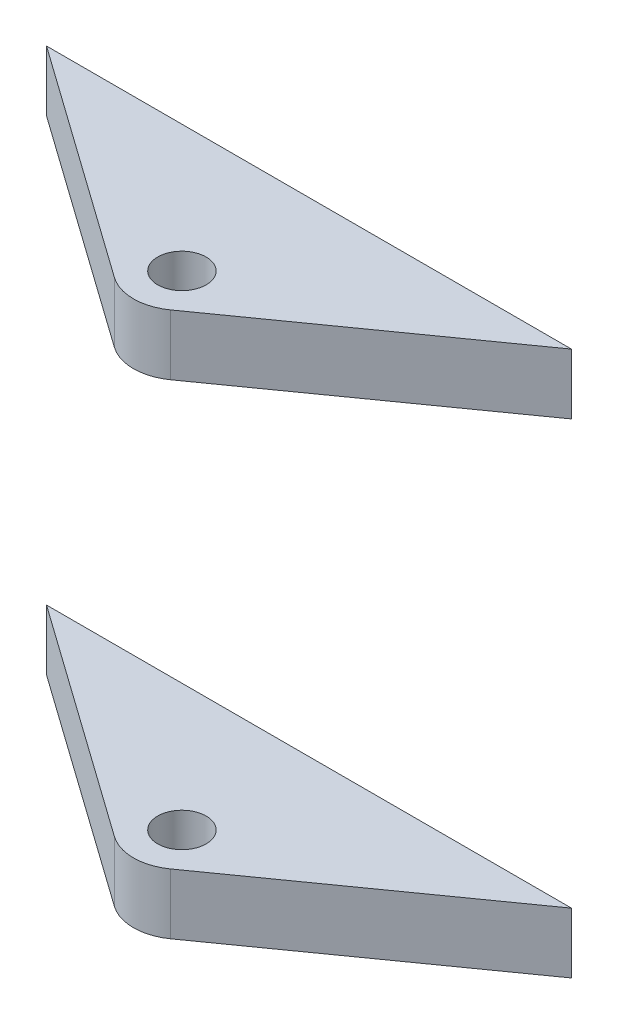
ISO-10303-21;
HEADER;
FILE_DESCRIPTION(('STEP AP214'),'2;1');
FILE_NAME('part.step','',(''),(''),'','','');
FILE_SCHEMA(('AUTOMOTIVE_DESIGN { 1 0 10303 214 1 1 1 1 }'));
ENDSEC;
DATA;
#1=APPLICATION_CONTEXT('core data for automotive mechanical design processes');
#2=APPLICATION_PROTOCOL_DEFINITION('international standard','automotive_design',2000,#1);
#3=PRODUCT_CONTEXT('',#1,'mechanical');
#4=PRODUCT('Part','Part','',(#3));
#5=PRODUCT_RELATED_PRODUCT_CATEGORY('part','',(#4));
#6=PRODUCT_DEFINITION_FORMATION('','',#4);
#7=PRODUCT_DEFINITION_CONTEXT('part definition',#1,'design');
#8=PRODUCT_DEFINITION('design','',#6,#7);
#9=PRODUCT_DEFINITION_SHAPE('','',#8);
#10=(LENGTH_UNIT() NAMED_UNIT(*) SI_UNIT(.MILLI.,.METRE.));
#11=(NAMED_UNIT(*) PLANE_ANGLE_UNIT() SI_UNIT($,.RADIAN.));
#12=(NAMED_UNIT(*) SI_UNIT($,.STERADIAN.) SOLID_ANGLE_UNIT());
#13=UNCERTAINTY_MEASURE_WITH_UNIT(LENGTH_MEASURE(1.E-05),#10,'distance_accuracy_value','');
#14=(GEOMETRIC_REPRESENTATION_CONTEXT(3) GLOBAL_UNCERTAINTY_ASSIGNED_CONTEXT((#13)) GLOBAL_UNIT_ASSIGNED_CONTEXT((#10,
#11,#12)) REPRESENTATION_CONTEXT('',''));
#15=CARTESIAN_POINT('',(0.,0.,0.));
#16=DIRECTION('',(0.,0.,1.));
#17=DIRECTION('',(1.,0.,0.));
#18=AXIS2_PLACEMENT_3D('',#15,#16,#17);
#19=CARTESIAN_POINT('',(-36.2210318050406,-50.2776773662799,50.));
#20=DIRECTION('',(0.,1.,0.));
#21=DIRECTION('',(0.,0.,1.));
#22=AXIS2_PLACEMENT_3D('',#19,#20,#21);
#23=PLANE('',#22);
#24=CARTESIAN_POINT('',(7.15234712720304,-50.2776773662799,21.));
#25=DIRECTION('',(0.,1.,0.));
#26=DIRECTION('',(0.,0.,1.));
#27=AXIS2_PLACEMENT_3D('',#24,#25,#26);
#28=CIRCLE('',#27,4.);
#29=CARTESIAN_POINT('',(7.15234712720304,-50.2776773662799,25.));
#30=VERTEX_POINT('',#29);
#31=EDGE_CURVE('E145',#30,#30,#28,.T.);
#32=ORIENTED_EDGE('',*,*,#31,.T.);
#33=EDGE_LOOP('',(#32));
#34=FACE_BOUND('',#33,.T.);
#35=DIRECTION('',(0.815221625916206,0.,-0.579149117791384));
#36=VECTOR('',#35,1.);
#37=CARTESIAN_POINT('',(16.9470207550481,-50.2776773662799,23.8549578855484));
#38=LINE('',#37,#36);
#39=CARTESIAN_POINT('',(11.7855400695341,-50.2776773662799,27.5217730073296));
#40=VERTEX_POINT('',#39);
#41=CARTESIAN_POINT('',(50.5257260594467,-50.2776773662799,0.));
#42=VERTEX_POINT('',#41);
#43=EDGE_CURVE('E136',#40,#42,#38,.T.);
#44=ORIENTED_EDGE('',*,*,#43,.F.);
#45=CARTESIAN_POINT('',(7.15234712720304,-50.2776773662799,21.));
#46=DIRECTION('',(0.,1.,0.));
#47=DIRECTION('',(0.,0.,1.));
#48=AXIS2_PLACEMENT_3D('',#45,#46,#47);
#49=CIRCLE('',#48,8.);
#50=CARTESIAN_POINT('',(2.51915418487198,-50.2776773662799,27.5217730073297));
#51=VERTEX_POINT('',#50);
#52=EDGE_CURVE('E137',#51,#40,#49,.T.);
#53=ORIENTED_EDGE('',*,*,#52,.F.);
#54=DIRECTION('',(0.815221625916206,0.,0.579149117791384));
#55=VECTOR('',#54,1.);
#56=CARTESIAN_POINT('',(-12.1490303186749,-50.2776773662799,17.1012127022923));
#57=LINE('',#56,#55);
#58=CARTESIAN_POINT('',(-36.2210318050406,-50.2776773662799,0.));
#59=VERTEX_POINT('',#58);
#60=EDGE_CURVE('E126',#59,#51,#57,.T.);
#61=ORIENTED_EDGE('',*,*,#60,.F.);
#62=DIRECTION('',(1.,0.,0.));
#63=VECTOR('',#62,1.);
#64=CARTESIAN_POINT('',(-36.2210318050406,-50.2776773662799,0.));
#65=LINE('',#64,#63);
#66=EDGE_CURVE('E160',#59,#42,#65,.T.);
#67=ORIENTED_EDGE('',*,*,#66,.T.);
#68=EDGE_LOOP('',(#44,#53,#61,#67));
#69=FACE_BOUND('',#68,.T.);
#70=ADVANCED_FACE('F87',(#34,#69),#23,.F.);
#71=CARTESIAN_POINT('',(-36.2210318050406,-40.2776773662799,50.));
#72=DIRECTION('',(0.,-1.,0.));
#73=DIRECTION('',(0.,0.,-1.));
#74=AXIS2_PLACEMENT_3D('',#71,#72,#73);
#75=PLANE('',#74);
#76=CARTESIAN_POINT('',(7.15234712720304,-40.2776773662799,21.));
#77=DIRECTION('',(0.,-1.,0.));
#78=DIRECTION('',(0.,0.,-1.));
#79=AXIS2_PLACEMENT_3D('',#76,#77,#78);
#80=CIRCLE('',#79,4.);
#81=CARTESIAN_POINT('',(7.15234712720304,-40.2776773662799,25.));
#82=VERTEX_POINT('',#81);
#83=EDGE_CURVE('E158',#82,#82,#80,.T.);
#84=ORIENTED_EDGE('',*,*,#83,.T.);
#85=EDGE_LOOP('',(#84));
#86=FACE_BOUND('',#85,.T.);
#87=DIRECTION('',(-0.815221625916206,0.,0.579149117791384));
#88=VECTOR('',#87,1.);
#89=CARTESIAN_POINT('',(-30.7317250040091,-40.2776773662799,57.7268556197676));
#90=LINE('',#89,#88);
#91=CARTESIAN_POINT('',(50.5257260594467,-40.2776773662799,0.));
#92=VERTEX_POINT('',#91);
#93=CARTESIAN_POINT('',(11.7855400695341,-40.2776773662799,27.5217730073296));
#94=VERTEX_POINT('',#93);
#95=EDGE_CURVE('E109',#92,#94,#90,.T.);
#96=ORIENTED_EDGE('',*,*,#95,.F.);
#97=DIRECTION('',(-1.,0.,0.));
#98=VECTOR('',#97,1.);
#99=CARTESIAN_POINT('',(-36.2210318050406,-40.2776773662799,0.));
#100=LINE('',#99,#98);
#101=CARTESIAN_POINT('',(-36.2210318050406,-40.2776773662799,0.));
#102=VERTEX_POINT('',#101);
#103=EDGE_CURVE('E94',#92,#102,#100,.T.);
#104=ORIENTED_EDGE('',*,*,#103,.T.);
#105=DIRECTION('',(-0.815221625916206,0.,-0.579149117791384));
#106=VECTOR('',#105,1.);
#107=CARTESIAN_POINT('',(-12.6142875323492,-40.2776773662799,16.7706850319269));
#108=LINE('',#107,#106);
#109=CARTESIAN_POINT('',(2.51915418487198,-40.2776773662799,27.5217730073297));
#110=VERTEX_POINT('',#109);
#111=EDGE_CURVE('E101',#110,#102,#108,.T.);
#112=ORIENTED_EDGE('',*,*,#111,.F.);
#113=CARTESIAN_POINT('',(7.15234712720304,-40.2776773662799,21.));
#114=DIRECTION('',(0.,-1.,0.));
#115=DIRECTION('',(0.,0.,-1.));
#116=AXIS2_PLACEMENT_3D('',#113,#114,#115);
#117=CIRCLE('',#116,8.);
#118=EDGE_CURVE('E13',#94,#110,#117,.T.);
#119=ORIENTED_EDGE('',*,*,#118,.F.);
#120=EDGE_LOOP('',(#96,#104,#112,#119));
#121=FACE_BOUND('',#120,.T.);
#122=ADVANCED_FACE('F167',(#86,#121),#75,.F.);
#123=CARTESIAN_POINT('',(0.,0.,0.));
#124=DIRECTION('',(0.,0.,-1.));
#125=DIRECTION('',(-1.,0.,0.));
#126=AXIS2_PLACEMENT_3D('',#123,#124,#125);
#127=PLANE('',#126);
#128=DIRECTION('',(0.,-1.,0.));
#129=VECTOR('',#128,1.);
#130=CARTESIAN_POINT('',(-36.2210318050406,-50.2776773662799,0.));
#131=LINE('',#130,#129);
#132=EDGE_CURVE('E131',#102,#59,#131,.T.);
#133=ORIENTED_EDGE('',*,*,#132,.F.);
#134=ORIENTED_EDGE('',*,*,#103,.F.);
#135=DIRECTION('',(0.,1.,0.));
#136=VECTOR('',#135,1.);
#137=CARTESIAN_POINT('',(50.5257260594467,-50.2776773662799,0.));
#138=LINE('',#137,#136);
#139=EDGE_CURVE('E162',#42,#92,#138,.T.);
#140=ORIENTED_EDGE('',*,*,#139,.F.);
#141=ORIENTED_EDGE('',*,*,#66,.F.);
#142=EDGE_LOOP('',(#133,#134,#140,#141));
#143=FACE_BOUND('',#142,.T.);
#144=ADVANCED_FACE('F187',(#143),#127,.T.);
#145=CARTESIAN_POINT('',(7.15234712720304,-50.2776773662799,21.));
#146=DIRECTION('',(0.,1.,0.));
#147=DIRECTION('',(0.,0.,1.));
#148=AXIS2_PLACEMENT_3D('',#145,#146,#147);
#149=CYLINDRICAL_SURFACE('',#148,8.);
#150=ORIENTED_EDGE('',*,*,#118,.T.);
#151=DIRECTION('',(0.,1.,0.));
#152=VECTOR('',#151,1.);
#153=CARTESIAN_POINT('',(2.51915418487198,-50.2776773662799,27.5217730073297));
#154=LINE('',#153,#152);
#155=EDGE_CURVE('E129',#51,#110,#154,.T.);
#156=ORIENTED_EDGE('',*,*,#155,.F.);
#157=ORIENTED_EDGE('',*,*,#52,.T.);
#158=DIRECTION('',(0.,1.,0.));
#159=VECTOR('',#158,1.);
#160=CARTESIAN_POINT('',(11.7855400695341,-50.2776773662799,27.5217730073296));
#161=LINE('',#160,#159);
#162=EDGE_CURVE('E142',#40,#94,#161,.T.);
#163=ORIENTED_EDGE('',*,*,#162,.T.);
#164=EDGE_LOOP('',(#150,#156,#157,#163));
#165=FACE_BOUND('',#164,.T.);
#166=ADVANCED_FACE('F140',(#165),#149,.T.);
#167=CARTESIAN_POINT('',(16.9470207550481,-50.2776773662799,23.8549578855484));
#168=DIRECTION('',(0.579149117791384,0.,0.815221625916206));
#169=DIRECTION('',(0.815221625916206,0.,-0.579149117791384));
#170=AXIS2_PLACEMENT_3D('',#167,#168,#169);
#171=PLANE('',#170);
#172=ORIENTED_EDGE('',*,*,#95,.T.);
#173=ORIENTED_EDGE('',*,*,#162,.F.);
#174=ORIENTED_EDGE('',*,*,#43,.T.);
#175=ORIENTED_EDGE('',*,*,#139,.T.);
#176=EDGE_LOOP('',(#172,#173,#174,#175));
#177=FACE_BOUND('',#176,.T.);
#178=ADVANCED_FACE('F177',(#177),#171,.T.);
#179=CARTESIAN_POINT('',(-12.1490303186749,-50.2776773662799,17.1012127022923));
#180=DIRECTION('',(-0.579149117791384,0.,0.815221625916206));
#181=DIRECTION('',(0.815221625916206,0.,0.579149117791384));
#182=AXIS2_PLACEMENT_3D('',#179,#180,#181);
#183=PLANE('',#182);
#184=ORIENTED_EDGE('',*,*,#111,.T.);
#185=ORIENTED_EDGE('',*,*,#132,.T.);
#186=ORIENTED_EDGE('',*,*,#60,.T.);
#187=ORIENTED_EDGE('',*,*,#155,.T.);
#188=EDGE_LOOP('',(#184,#185,#186,#187));
#189=FACE_BOUND('',#188,.T.);
#190=ADVANCED_FACE('F128',(#189),#183,.T.);
#191=CARTESIAN_POINT('',(7.15234712720304,-50.2776773662799,21.));
#192=DIRECTION('',(0.,1.,0.));
#193=DIRECTION('',(0.,0.,1.));
#194=AXIS2_PLACEMENT_3D('',#191,#192,#193);
#195=CYLINDRICAL_SURFACE('',#194,4.);
#196=CARTESIAN_POINT('',(7.15234712720304,-50.2776773662799,25.));
#197=CARTESIAN_POINT('',(7.15234712720304,-50.1735106996133,25.));
#198=CARTESIAN_POINT('',(7.15234712720304,-50.0693440329466,25.));
#199=CARTESIAN_POINT('',(7.15234712720304,-49.8610106996133,25.));
#200=CARTESIAN_POINT('',(7.15234712720304,-49.7568440329466,25.));
#201=CARTESIAN_POINT('',(7.15234712720304,-49.5485106996133,25.));
#202=CARTESIAN_POINT('',(7.15234712720304,-49.4443440329466,25.));
#203=CARTESIAN_POINT('',(7.15234712720304,-49.2360106996133,25.));
#204=CARTESIAN_POINT('',(7.15234712720304,-49.1318440329466,25.));
#205=CARTESIAN_POINT('',(7.15234712720304,-48.9235106996133,25.));
#206=CARTESIAN_POINT('',(7.15234712720304,-48.8193440329466,25.));
#207=CARTESIAN_POINT('',(7.15234712720304,-48.6110106996133,25.));
#208=CARTESIAN_POINT('',(7.15234712720304,-48.5068440329466,25.));
#209=CARTESIAN_POINT('',(7.15234712720304,-48.2985106996133,25.));
#210=CARTESIAN_POINT('',(7.15234712720304,-48.1943440329466,25.));
#211=CARTESIAN_POINT('',(7.15234712720304,-47.9860106996133,25.));
#212=CARTESIAN_POINT('',(7.15234712720304,-47.8818440329466,25.));
#213=CARTESIAN_POINT('',(7.15234712720304,-47.6735106996133,25.));
#214=CARTESIAN_POINT('',(7.15234712720304,-47.5693440329466,25.));
#215=CARTESIAN_POINT('',(7.15234712720304,-47.3610106996133,25.));
#216=CARTESIAN_POINT('',(7.15234712720304,-47.2568440329466,25.));
#217=CARTESIAN_POINT('',(7.15234712720304,-47.0485106996133,25.));
#218=CARTESIAN_POINT('',(7.15234712720304,-46.9443440329466,25.));
#219=CARTESIAN_POINT('',(7.15234712720304,-46.7360106996133,25.));
#220=CARTESIAN_POINT('',(7.15234712720304,-46.6318440329466,25.));
#221=CARTESIAN_POINT('',(7.15234712720304,-46.4235106996133,25.));
#222=CARTESIAN_POINT('',(7.15234712720304,-46.3193440329466,25.));
#223=CARTESIAN_POINT('',(7.15234712720304,-46.1110106996133,25.));
#224=CARTESIAN_POINT('',(7.15234712720304,-46.0068440329466,25.));
#225=CARTESIAN_POINT('',(7.15234712720304,-45.7985106996133,25.));
#226=CARTESIAN_POINT('',(7.15234712720304,-45.6943440329466,25.));
#227=CARTESIAN_POINT('',(7.15234712720304,-45.4860106996133,25.));
#228=CARTESIAN_POINT('',(7.15234712720304,-45.3818440329466,25.));
#229=CARTESIAN_POINT('',(7.15234712720304,-45.1735106996133,25.));
#230=CARTESIAN_POINT('',(7.15234712720304,-45.0693440329466,25.));
#231=CARTESIAN_POINT('',(7.15234712720304,-44.8610106996133,25.));
#232=CARTESIAN_POINT('',(7.15234712720304,-44.7568440329466,25.));
#233=CARTESIAN_POINT('',(7.15234712720304,-44.5485106996133,25.));
#234=CARTESIAN_POINT('',(7.15234712720304,-44.4443440329466,25.));
#235=CARTESIAN_POINT('',(7.15234712720304,-44.2360106996133,25.));
#236=CARTESIAN_POINT('',(7.15234712720304,-44.1318440329466,25.));
#237=CARTESIAN_POINT('',(7.15234712720304,-43.9235106996133,25.));
#238=CARTESIAN_POINT('',(7.15234712720304,-43.8193440329466,25.));
#239=CARTESIAN_POINT('',(7.15234712720304,-43.6110106996133,25.));
#240=CARTESIAN_POINT('',(7.15234712720304,-43.5068440329466,25.));
#241=CARTESIAN_POINT('',(7.15234712720304,-43.2985106996133,25.));
#242=CARTESIAN_POINT('',(7.15234712720304,-43.1943440329466,25.));
#243=CARTESIAN_POINT('',(7.15234712720304,-42.9860106996133,25.));
#244=CARTESIAN_POINT('',(7.15234712720304,-42.8818440329466,25.));
#245=CARTESIAN_POINT('',(7.15234712720304,-42.6735106996133,25.));
#246=CARTESIAN_POINT('',(7.15234712720304,-42.5693440329466,25.));
#247=CARTESIAN_POINT('',(7.15234712720304,-42.3610106996133,25.));
#248=CARTESIAN_POINT('',(7.15234712720304,-42.2568440329466,25.));
#249=CARTESIAN_POINT('',(7.15234712720304,-42.0485106996133,25.));
#250=CARTESIAN_POINT('',(7.15234712720304,-41.9443440329466,25.));
#251=CARTESIAN_POINT('',(7.15234712720304,-41.7360106996133,25.));
#252=CARTESIAN_POINT('',(7.15234712720304,-41.6318440329466,25.));
#253=CARTESIAN_POINT('',(7.15234712720304,-41.4235106996133,25.));
#254=CARTESIAN_POINT('',(7.15234712720304,-41.3193440329466,25.));
#255=CARTESIAN_POINT('',(7.15234712720304,-41.1110106996133,25.));
#256=CARTESIAN_POINT('',(7.15234712720304,-41.0068440329466,25.));
#257=CARTESIAN_POINT('',(7.15234712720304,-40.7985106996133,25.));
#258=CARTESIAN_POINT('',(7.15234712720304,-40.6943440329466,25.));
#259=CARTESIAN_POINT('',(7.15234712720304,-40.4860106996133,25.));
#260=CARTESIAN_POINT('',(7.15234712720304,-40.3818440329466,25.));
#261=CARTESIAN_POINT('',(7.15234712720304,-40.2776773662799,25.));
#262=B_SPLINE_CURVE_WITH_KNOTS('',3,(#196,#197,#198,#199,#200,#201,#202,#203,#204,#205,#206,
#207,#208,#209,#210,#211,#212,#213,#214,#215,#216,#217,#218,#219,#220,#221,#222,#223,#224,#225,
#226,#227,#228,#229,#230,#231,#232,#233,#234,#235,#236,#237,#238,#239,#240,#241,#242,#243,#244,
#245,#246,#247,#248,#249,#250,#251,#252,#253,#254,#255,#256,#257,#258,#259,#260,#261),
.UNSPECIFIED.,.F.,.F.,(4,2,2,2,2,2,2,2,2,2,2,2,2,2,2,2,2,2,2,2,2,2,2,2,2,2,2,2,2,2,2,2,4),(0.,
0.3125,0.625000000000001,0.937500000000001,1.25,1.5625,1.875,2.1875,2.5,2.8125,3.125,3.4375,
3.75,4.0625,4.375,4.6875,5.,5.3125,5.62500000000001,5.93750000000001,6.25000000000001,
6.56250000000001,6.87500000000001,7.18750000000001,7.50000000000001,7.81250000000001,
8.12500000000001,8.43750000000001,8.75000000000001,9.06250000000001,9.37500000000001,
9.68750000000001,10.),.UNSPECIFIED.);
#263=EDGE_CURVE('BSEAM170',#30,#82,#262,.T.);
#264=ORIENTED_EDGE('',*,*,#31,.F.);
#265=ORIENTED_EDGE('',*,*,#83,.F.);
#266=ORIENTED_EDGE('',*,*,#263,.T.);
#267=ORIENTED_EDGE('',*,*,#263,.F.);
#268=EDGE_LOOP('',(#264,#266,#265,#267));
#269=FACE_BOUND('',#268,.T.);
#270=ADVANCED_FACE('F170',(#269),#195,.F.);
#271=CLOSED_SHELL('',(#70,#122,#144,#166,#178,#190,#270));
#272=MANIFOLD_SOLID_BREP('B2',#271);
#273=CARTESIAN_POINT('',(-36.2210318050406,29.7223226337201,50.));
#274=DIRECTION('',(0.,1.,0.));
#275=DIRECTION('',(0.,0.,1.));
#276=AXIS2_PLACEMENT_3D('',#273,#274,#275);
#277=PLANE('',#276);
#278=CARTESIAN_POINT('',(7.15234712720304,29.7223226337201,21.));
#279=DIRECTION('',(0.,1.,0.));
#280=DIRECTION('',(0.,0.,1.));
#281=AXIS2_PLACEMENT_3D('',#278,#279,#280);
#282=CIRCLE('',#281,4.);
#283=CARTESIAN_POINT('',(7.15234712720304,29.7223226337201,25.));
#284=VERTEX_POINT('',#283);
#285=EDGE_CURVE('E294',#284,#284,#282,.T.);
#286=ORIENTED_EDGE('',*,*,#285,.T.);
#287=EDGE_LOOP('',(#286));
#288=FACE_BOUND('',#287,.T.);
#289=DIRECTION('',(0.815221625916206,0.,-0.579149117791384));
#290=VECTOR('',#289,1.);
#291=CARTESIAN_POINT('',(-30.7317250040091,29.7223226337201,57.7268556197676));
#292=LINE('',#291,#290);
#293=CARTESIAN_POINT('',(11.7855400695341,29.7223226337201,27.5217730073296));
#294=VERTEX_POINT('',#293);
#295=CARTESIAN_POINT('',(50.5257260594467,29.72232263372,0.));
#296=VERTEX_POINT('',#295);
#297=EDGE_CURVE('E290',#294,#296,#292,.T.);
#298=ORIENTED_EDGE('',*,*,#297,.F.);
#299=CARTESIAN_POINT('',(7.15234712720304,29.7223226337201,21.));
#300=DIRECTION('',(0.,1.,0.));
#301=DIRECTION('',(0.,0.,1.));
#302=AXIS2_PLACEMENT_3D('',#299,#300,#301);
#303=CIRCLE('',#302,8.);
#304=CARTESIAN_POINT('',(2.51915418487198,29.7223226337201,27.5217730073297));
#305=VERTEX_POINT('',#304);
#306=EDGE_CURVE('E297',#305,#294,#303,.T.);
#307=ORIENTED_EDGE('',*,*,#306,.F.);
#308=DIRECTION('',(0.815221625916206,0.,0.579149117791384));
#309=VECTOR('',#308,1.);
#310=CARTESIAN_POINT('',(-12.6142875323492,29.7223226337201,16.7706850319269));
#311=LINE('',#310,#309);
#312=CARTESIAN_POINT('',(-36.2210318050406,29.72232263372,0.));
#313=VERTEX_POINT('',#312);
#314=EDGE_CURVE('E274',#313,#305,#311,.T.);
#315=ORIENTED_EDGE('',*,*,#314,.F.);
#316=DIRECTION('',(1.,0.,0.));
#317=VECTOR('',#316,1.);
#318=CARTESIAN_POINT('',(-36.2210318050406,29.7223226337201,0.));
#319=LINE('',#318,#317);
#320=EDGE_CURVE('E301',#313,#296,#319,.T.);
#321=ORIENTED_EDGE('',*,*,#320,.T.);
#322=EDGE_LOOP('',(#298,#307,#315,#321));
#323=FACE_BOUND('',#322,.T.);
#324=ADVANCED_FACE('F236',(#288,#323),#277,.F.);
#325=CARTESIAN_POINT('',(-36.2210318050406,39.7223226337201,50.));
#326=DIRECTION('',(0.,-1.,0.));
#327=DIRECTION('',(0.,0.,-1.));
#328=AXIS2_PLACEMENT_3D('',#325,#326,#327);
#329=PLANE('',#328);
#330=CARTESIAN_POINT('',(7.15234712720304,39.7223226337201,21.));
#331=DIRECTION('',(0.,-1.,0.));
#332=DIRECTION('',(0.,0.,-1.));
#333=AXIS2_PLACEMENT_3D('',#330,#331,#332);
#334=CIRCLE('',#333,4.);
#335=CARTESIAN_POINT('',(7.15234712720304,39.7223226337201,25.));
#336=VERTEX_POINT('',#335);
#337=EDGE_CURVE('E293',#336,#336,#334,.T.);
#338=ORIENTED_EDGE('',*,*,#337,.T.);
#339=EDGE_LOOP('',(#338));
#340=FACE_BOUND('',#339,.T.);
#341=DIRECTION('',(-0.815221625916206,0.,0.579149117791384));
#342=VECTOR('',#341,1.);
#343=CARTESIAN_POINT('',(-30.7317250040091,39.7223226337201,57.7268556197676));
#344=LINE('',#343,#342);
#345=CARTESIAN_POINT('',(50.5257260594467,39.72232263372,0.));
#346=VERTEX_POINT('',#345);
#347=CARTESIAN_POINT('',(11.7855400695341,39.72232263372,27.5217730073296));
#348=VERTEX_POINT('',#347);
#349=EDGE_CURVE('E265',#346,#348,#344,.T.);
#350=ORIENTED_EDGE('',*,*,#349,.F.);
#351=DIRECTION('',(-1.,0.,0.));
#352=VECTOR('',#351,1.);
#353=CARTESIAN_POINT('',(-36.2210318050406,39.7223226337201,0.));
#354=LINE('',#353,#352);
#355=CARTESIAN_POINT('',(-36.2210318050406,39.7223226337201,0.));
#356=VERTEX_POINT('',#355);
#357=EDGE_CURVE('E244',#346,#356,#354,.T.);
#358=ORIENTED_EDGE('',*,*,#357,.T.);
#359=DIRECTION('',(-0.815221625916206,0.,-0.579149117791384));
#360=VECTOR('',#359,1.);
#361=CARTESIAN_POINT('',(-12.6142875323492,39.7223226337201,16.7706850319269));
#362=LINE('',#361,#360);
#363=CARTESIAN_POINT('',(2.51915418487198,39.72232263372,27.5217730073297));
#364=VERTEX_POINT('',#363);
#365=EDGE_CURVE('E252',#364,#356,#362,.T.);
#366=ORIENTED_EDGE('',*,*,#365,.F.);
#367=CARTESIAN_POINT('',(7.15234712720304,39.72232263372,21.));
#368=DIRECTION('',(0.,1.,0.));
#369=DIRECTION('',(0.,0.,1.));
#370=AXIS2_PLACEMENT_3D('',#367,#368,#369);
#371=CIRCLE('',#370,8.);
#372=EDGE_CURVE('E85',#348,#364,#371,.F.);
#373=ORIENTED_EDGE('',*,*,#372,.F.);
#374=EDGE_LOOP('',(#350,#358,#366,#373));
#375=FACE_BOUND('',#374,.T.);
#376=ADVANCED_FACE('F282',(#340,#375),#329,.F.);
#377=CARTESIAN_POINT('',(0.,0.,0.));
#378=DIRECTION('',(0.,0.,1.));
#379=DIRECTION('',(1.,0.,0.));
#380=AXIS2_PLACEMENT_3D('',#377,#378,#379);
#381=PLANE('',#380);
#382=DIRECTION('',(0.,-1.,0.));
#383=VECTOR('',#382,1.);
#384=CARTESIAN_POINT('',(-36.2210318050406,39.7223226337201,0.));
#385=LINE('',#384,#383);
#386=EDGE_CURVE('E299',#356,#313,#385,.T.);
#387=ORIENTED_EDGE('',*,*,#386,.F.);
#388=ORIENTED_EDGE('',*,*,#357,.F.);
#389=DIRECTION('',(0.,1.,0.));
#390=VECTOR('',#389,1.);
#391=CARTESIAN_POINT('',(50.5257260594467,39.7223226337201,0.));
#392=LINE('',#391,#390);
#393=EDGE_CURVE('E304',#296,#346,#392,.T.);
#394=ORIENTED_EDGE('',*,*,#393,.F.);
#395=ORIENTED_EDGE('',*,*,#320,.F.);
#396=EDGE_LOOP('',(#387,#388,#394,#395));
#397=FACE_BOUND('',#396,.T.);
#398=ADVANCED_FACE('F326',(#397),#381,.F.);
#399=CARTESIAN_POINT('',(7.15234712720304,-50.2776773662799,21.));
#400=DIRECTION('',(0.,1.,0.));
#401=DIRECTION('',(0.,0.,1.));
#402=AXIS2_PLACEMENT_3D('',#399,#400,#401);
#403=CYLINDRICAL_SURFACE('',#402,8.);
#404=ORIENTED_EDGE('',*,*,#306,.T.);
#405=DIRECTION('',(0.,1.,0.));
#406=VECTOR('',#405,1.);
#407=CARTESIAN_POINT('',(11.7855400695341,-50.2776773662799,27.5217730073296));
#408=LINE('',#407,#406);
#409=EDGE_CURVE('E277',#294,#348,#408,.T.);
#410=ORIENTED_EDGE('',*,*,#409,.T.);
#411=ORIENTED_EDGE('',*,*,#372,.T.);
#412=DIRECTION('',(0.,1.,0.));
#413=VECTOR('',#412,1.);
#414=CARTESIAN_POINT('',(2.51915418487198,-50.2776773662799,27.5217730073297));
#415=LINE('',#414,#413);
#416=EDGE_CURVE('E271',#305,#364,#415,.T.);
#417=ORIENTED_EDGE('',*,*,#416,.F.);
#418=EDGE_LOOP('',(#404,#410,#411,#417));
#419=FACE_BOUND('',#418,.T.);
#420=ADVANCED_FACE('F280',(#419),#403,.T.);
#421=CARTESIAN_POINT('',(16.9470207550481,-50.2776773662799,23.8549578855484));
#422=DIRECTION('',(0.579149117791384,0.,0.815221625916206));
#423=DIRECTION('',(0.815221625916206,0.,-0.579149117791384));
#424=AXIS2_PLACEMENT_3D('',#421,#422,#423);
#425=PLANE('',#424);
#426=ORIENTED_EDGE('',*,*,#297,.T.);
#427=ORIENTED_EDGE('',*,*,#393,.T.);
#428=ORIENTED_EDGE('',*,*,#349,.T.);
#429=ORIENTED_EDGE('',*,*,#409,.F.);
#430=EDGE_LOOP('',(#426,#427,#428,#429));
#431=FACE_BOUND('',#430,.T.);
#432=ADVANCED_FACE('F322',(#431),#425,.T.);
#433=CARTESIAN_POINT('',(-12.1490303186749,-50.2776773662799,17.1012127022923));
#434=DIRECTION('',(-0.579149117791384,0.,0.815221625916206));
#435=DIRECTION('',(0.815221625916206,0.,0.579149117791384));
#436=AXIS2_PLACEMENT_3D('',#433,#434,#435);
#437=PLANE('',#436);
#438=ORIENTED_EDGE('',*,*,#314,.T.);
#439=ORIENTED_EDGE('',*,*,#416,.T.);
#440=ORIENTED_EDGE('',*,*,#365,.T.);
#441=ORIENTED_EDGE('',*,*,#386,.T.);
#442=EDGE_LOOP('',(#438,#439,#440,#441));
#443=FACE_BOUND('',#442,.T.);
#444=ADVANCED_FACE('F272',(#443),#437,.T.);
#445=CARTESIAN_POINT('',(7.15234712720304,-50.2776773662799,21.));
#446=DIRECTION('',(0.,1.,0.));
#447=DIRECTION('',(0.,0.,1.));
#448=AXIS2_PLACEMENT_3D('',#445,#446,#447);
#449=CYLINDRICAL_SURFACE('',#448,4.);
#450=CARTESIAN_POINT('',(7.15234712720304,39.7223226337201,25.));
#451=CARTESIAN_POINT('',(7.15234712720304,39.6181559670534,25.));
#452=CARTESIAN_POINT('',(7.15234712720304,39.5139893003867,25.));
#453=CARTESIAN_POINT('',(7.15234712720304,39.3056559670534,25.));
#454=CARTESIAN_POINT('',(7.15234712720304,39.2014893003867,25.));
#455=CARTESIAN_POINT('',(7.15234712720304,38.9931559670534,25.));
#456=CARTESIAN_POINT('',(7.15234712720304,38.8889893003867,25.));
#457=CARTESIAN_POINT('',(7.15234712720304,38.6806559670534,25.));
#458=CARTESIAN_POINT('',(7.15234712720304,38.5764893003867,25.));
#459=CARTESIAN_POINT('',(7.15234712720304,38.3681559670534,25.));
#460=CARTESIAN_POINT('',(7.15234712720304,38.2639893003867,25.));
#461=CARTESIAN_POINT('',(7.15234712720304,38.0556559670534,25.));
#462=CARTESIAN_POINT('',(7.15234712720304,37.9514893003867,25.));
#463=CARTESIAN_POINT('',(7.15234712720304,37.7431559670534,25.));
#464=CARTESIAN_POINT('',(7.15234712720304,37.6389893003867,25.));
#465=CARTESIAN_POINT('',(7.15234712720304,37.4306559670534,25.));
#466=CARTESIAN_POINT('',(7.15234712720304,37.3264893003867,25.));
#467=CARTESIAN_POINT('',(7.15234712720304,37.1181559670534,25.));
#468=CARTESIAN_POINT('',(7.15234712720304,37.0139893003867,25.));
#469=CARTESIAN_POINT('',(7.15234712720304,36.8056559670534,25.));
#470=CARTESIAN_POINT('',(7.15234712720304,36.7014893003867,25.));
#471=CARTESIAN_POINT('',(7.15234712720304,36.4931559670534,25.));
#472=CARTESIAN_POINT('',(7.15234712720304,36.3889893003867,25.));
#473=CARTESIAN_POINT('',(7.15234712720304,36.1806559670534,25.));
#474=CARTESIAN_POINT('',(7.15234712720304,36.0764893003867,25.));
#475=CARTESIAN_POINT('',(7.15234712720304,35.8681559670534,25.));
#476=CARTESIAN_POINT('',(7.15234712720304,35.7639893003867,25.));
#477=CARTESIAN_POINT('',(7.15234712720304,35.5556559670534,25.));
#478=CARTESIAN_POINT('',(7.15234712720304,35.4514893003867,25.));
#479=CARTESIAN_POINT('',(7.15234712720304,35.2431559670534,25.));
#480=CARTESIAN_POINT('',(7.15234712720304,35.1389893003867,25.));
#481=CARTESIAN_POINT('',(7.15234712720304,34.9306559670534,25.));
#482=CARTESIAN_POINT('',(7.15234712720304,34.8264893003867,25.));
#483=CARTESIAN_POINT('',(7.15234712720304,34.6181559670534,25.));
#484=CARTESIAN_POINT('',(7.15234712720304,34.5139893003867,25.));
#485=CARTESIAN_POINT('',(7.15234712720304,34.3056559670534,25.));
#486=CARTESIAN_POINT('',(7.15234712720304,34.2014893003867,25.));
#487=CARTESIAN_POINT('',(7.15234712720304,33.9931559670534,25.));
#488=CARTESIAN_POINT('',(7.15234712720304,33.8889893003867,25.));
#489=CARTESIAN_POINT('',(7.15234712720304,33.6806559670534,25.));
#490=CARTESIAN_POINT('',(7.15234712720304,33.5764893003867,25.));
#491=CARTESIAN_POINT('',(7.15234712720304,33.3681559670534,25.));
#492=CARTESIAN_POINT('',(7.15234712720304,33.2639893003867,25.));
#493=CARTESIAN_POINT('',(7.15234712720304,33.0556559670534,25.));
#494=CARTESIAN_POINT('',(7.15234712720304,32.9514893003867,25.));
#495=CARTESIAN_POINT('',(7.15234712720304,32.7431559670534,25.));
#496=CARTESIAN_POINT('',(7.15234712720304,32.6389893003867,25.));
#497=CARTESIAN_POINT('',(7.15234712720304,32.4306559670534,25.));
#498=CARTESIAN_POINT('',(7.15234712720304,32.3264893003867,25.));
#499=CARTESIAN_POINT('',(7.15234712720304,32.1181559670534,25.));
#500=CARTESIAN_POINT('',(7.15234712720304,32.0139893003867,25.));
#501=CARTESIAN_POINT('',(7.15234712720304,31.8056559670534,25.));
#502=CARTESIAN_POINT('',(7.15234712720304,31.7014893003867,25.));
#503=CARTESIAN_POINT('',(7.15234712720304,31.4931559670534,25.));
#504=CARTESIAN_POINT('',(7.15234712720304,31.3889893003867,25.));
#505=CARTESIAN_POINT('',(7.15234712720304,31.1806559670534,25.));
#506=CARTESIAN_POINT('',(7.15234712720304,31.0764893003867,25.));
#507=CARTESIAN_POINT('',(7.15234712720304,30.8681559670534,25.));
#508=CARTESIAN_POINT('',(7.15234712720304,30.7639893003867,25.));
#509=CARTESIAN_POINT('',(7.15234712720304,30.5556559670534,25.));
#510=CARTESIAN_POINT('',(7.15234712720304,30.4514893003867,25.));
#511=CARTESIAN_POINT('',(7.15234712720304,30.2431559670534,25.));
#512=CARTESIAN_POINT('',(7.15234712720304,30.1389893003867,25.));
#513=CARTESIAN_POINT('',(7.15234712720304,29.9306559670534,25.));
#514=CARTESIAN_POINT('',(7.15234712720304,29.8264893003867,25.));
#515=CARTESIAN_POINT('',(7.15234712720304,29.7223226337201,25.));
#516=B_SPLINE_CURVE_WITH_KNOTS('',3,(#450,#451,#452,#453,#454,#455,#456,#457,#458,#459,#460,
#461,#462,#463,#464,#465,#466,#467,#468,#469,#470,#471,#472,#473,#474,#475,#476,#477,#478,#479,
#480,#481,#482,#483,#484,#485,#486,#487,#488,#489,#490,#491,#492,#493,#494,#495,#496,#497,#498,
#499,#500,#501,#502,#503,#504,#505,#506,#507,#508,#509,#510,#511,#512,#513,#514,#515),
.UNSPECIFIED.,.F.,.F.,(4,2,2,2,2,2,2,2,2,2,2,2,2,2,2,2,2,2,2,2,2,2,2,2,2,2,2,2,2,2,2,2,4),(0.,
0.312499999999993,0.625000000000001,0.937500000000008,1.25,1.56249999999999,1.875,
2.18750000000001,2.5,2.8125,3.125,3.43750000000001,3.75,4.0625,4.375,4.68750000000001,5.,5.3125,
5.62500000000001,5.93750000000001,6.25000000000001,6.5625,6.87500000000001,7.18750000000001,
7.50000000000001,7.8125,8.12500000000001,8.43750000000001,8.75000000000001,9.0625,
9.37500000000001,9.68750000000002,10.),.UNSPECIFIED.);
#517=EDGE_CURVE('BSEAM310',#336,#284,#516,.T.);
#518=ORIENTED_EDGE('',*,*,#337,.F.);
#519=ORIENTED_EDGE('',*,*,#285,.F.);
#520=ORIENTED_EDGE('',*,*,#517,.T.);
#521=ORIENTED_EDGE('',*,*,#517,.F.);
#522=EDGE_LOOP('',(#518,#520,#519,#521));
#523=FACE_BOUND('',#522,.T.);
#524=ADVANCED_FACE('F310',(#523),#449,.F.);
#525=CLOSED_SHELL('',(#324,#376,#398,#420,#432,#444,#524));
#526=MANIFOLD_SOLID_BREP('B7',#525);
#527=ADVANCED_BREP_SHAPE_REPRESENTATION('',(#18,#272,#526),#14);
#528=SHAPE_DEFINITION_REPRESENTATION(#9,#527);
ENDSEC;
END-ISO-10303-21;
